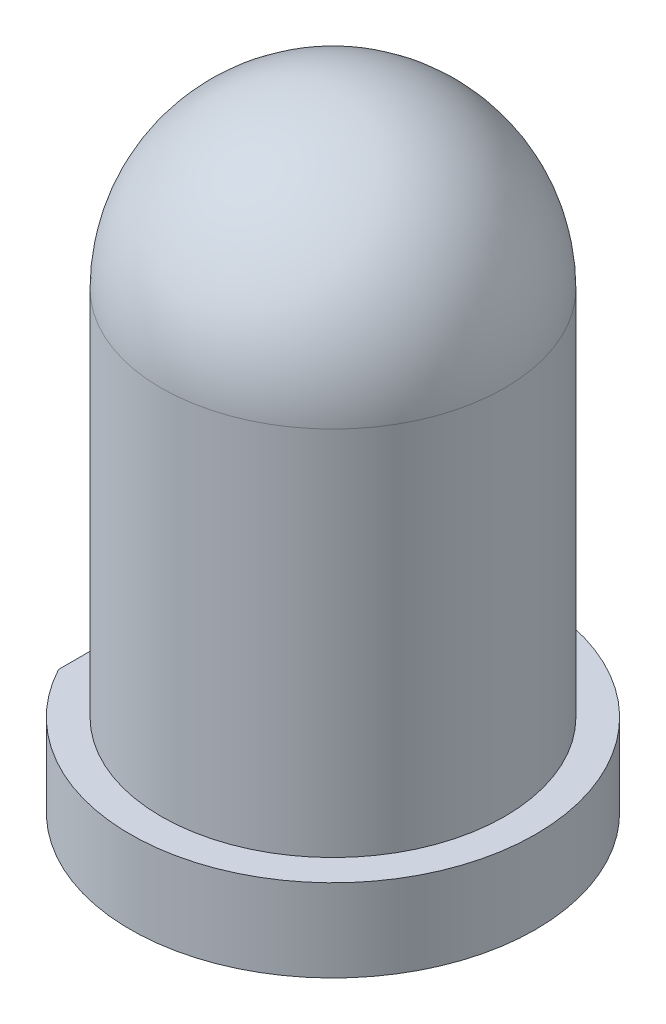
ISO-10303-21;
HEADER;
FILE_DESCRIPTION(('STEP AP214'),'2;1');
FILE_NAME('part.step','',(''),(''),'','','');
FILE_SCHEMA(('AUTOMOTIVE_DESIGN { 1 0 10303 214 1 1 1 1 }'));
ENDSEC;
DATA;
#1=APPLICATION_CONTEXT('core data for automotive mechanical design processes');
#2=APPLICATION_PROTOCOL_DEFINITION('international standard','automotive_design',2000,#1);
#3=PRODUCT_CONTEXT('',#1,'mechanical');
#4=PRODUCT('Part','Part','',(#3));
#5=PRODUCT_RELATED_PRODUCT_CATEGORY('part','',(#4));
#6=PRODUCT_DEFINITION_FORMATION('','',#4);
#7=PRODUCT_DEFINITION_CONTEXT('part definition',#1,'design');
#8=PRODUCT_DEFINITION('design','',#6,#7);
#9=PRODUCT_DEFINITION_SHAPE('','',#8);
#10=(LENGTH_UNIT() NAMED_UNIT(*) SI_UNIT(.MILLI.,.METRE.));
#11=(NAMED_UNIT(*) PLANE_ANGLE_UNIT() SI_UNIT($,.RADIAN.));
#12=(NAMED_UNIT(*) SI_UNIT($,.STERADIAN.) SOLID_ANGLE_UNIT());
#13=UNCERTAINTY_MEASURE_WITH_UNIT(LENGTH_MEASURE(1.E-05),#10,'distance_accuracy_value','');
#14=(GEOMETRIC_REPRESENTATION_CONTEXT(3) GLOBAL_UNCERTAINTY_ASSIGNED_CONTEXT((#13)) GLOBAL_UNIT_ASSIGNED_CONTEXT((#10,
#11,#12)) REPRESENTATION_CONTEXT('',''));
#15=CARTESIAN_POINT('',(0.,0.,0.));
#16=DIRECTION('',(0.,0.,1.));
#17=DIRECTION('',(1.,0.,0.));
#18=AXIS2_PLACEMENT_3D('',#15,#16,#17);
#19=CARTESIAN_POINT('',(0.,0.,0.));
#20=DIRECTION('',(0.,1.,0.));
#21=DIRECTION('',(0.,0.,1.));
#22=AXIS2_PLACEMENT_3D('',#19,#20,#21);
#23=PLANE('',#22);
#24=DIRECTION('',(0.,0.,-1.));
#25=VECTOR('',#24,1.);
#26=CARTESIAN_POINT('',(-2.6,0.,1.393735986477));
#27=LINE('',#26,#25);
#28=CARTESIAN_POINT('',(-2.6,0.,1.39373598647682));
#29=VERTEX_POINT('',#28);
#30=CARTESIAN_POINT('',(-2.59999999999998,0.,-1.39373598647684));
#31=VERTEX_POINT('',#30);
#32=EDGE_CURVE('E50',#29,#31,#27,.T.);
#33=ORIENTED_EDGE('',*,*,#32,.T.);
#34=CARTESIAN_POINT('',(0.,0.,0.));
#35=DIRECTION('',(0.,-1.,0.));
#36=DIRECTION('',(0.,0.,-1.));
#37=AXIS2_PLACEMENT_3D('',#34,#35,#36);
#38=CIRCLE('',#37,2.95);
#39=EDGE_CURVE('E21',#29,#31,#38,.F.);
#40=ORIENTED_EDGE('',*,*,#39,.F.);
#41=EDGE_LOOP('',(#33,#40));
#42=FACE_BOUND('',#41,.T.);
#43=ADVANCED_FACE('F17',(#42),#23,.F.);
#44=CARTESIAN_POINT('',(0.,-5.1,0.));
#45=DIRECTION('',(0.,-1.,0.));
#46=DIRECTION('',(0.,0.,-1.));
#47=AXIS2_PLACEMENT_3D('',#44,#45,#46);
#48=CYLINDRICAL_SURFACE('',#47,2.95);
#49=DIRECTION('',(0.,1.,0.));
#50=VECTOR('',#49,1.);
#51=CARTESIAN_POINT('',(-2.6,0.,1.393735986477));
#52=LINE('',#51,#50);
#53=CARTESIAN_POINT('',(-2.6,1.2,1.39373598647682));
#54=VERTEX_POINT('',#53);
#55=EDGE_CURVE('E48',#54,#29,#52,.F.);
#56=ORIENTED_EDGE('',*,*,#55,.T.);
#57=ORIENTED_EDGE('',*,*,#39,.T.);
#58=DIRECTION('',(0.,1.,0.));
#59=VECTOR('',#58,1.);
#60=CARTESIAN_POINT('',(-2.59999999999998,0.,-1.393735986477));
#61=LINE('',#60,#59);
#62=CARTESIAN_POINT('',(-2.59999999999999,1.2,-1.39373598647682));
#63=VERTEX_POINT('',#62);
#64=EDGE_CURVE('E46',#31,#63,#61,.T.);
#65=ORIENTED_EDGE('',*,*,#64,.T.);
#66=CARTESIAN_POINT('',(0.,1.2,0.));
#67=DIRECTION('',(0.,-1.,0.));
#68=DIRECTION('',(0.,0.,-1.));
#69=AXIS2_PLACEMENT_3D('',#66,#67,#68);
#70=CIRCLE('',#69,2.95);
#71=EDGE_CURVE('E36',#63,#54,#70,.T.);
#72=ORIENTED_EDGE('',*,*,#71,.T.);
#73=EDGE_LOOP('',(#56,#57,#65,#72));
#74=FACE_BOUND('',#73,.T.);
#75=ADVANCED_FACE('F44',(#74),#48,.T.);
#76=CARTESIAN_POINT('',(-2.6,0.,1.393735986477));
#77=DIRECTION('',(1.,0.,0.));
#78=DIRECTION('',(0.,0.,-1.));
#79=AXIS2_PLACEMENT_3D('',#76,#77,#78);
#80=PLANE('',#79);
#81=ORIENTED_EDGE('',*,*,#32,.F.);
#82=ORIENTED_EDGE('',*,*,#55,.F.);
#83=DIRECTION('',(0.,0.,-1.));
#84=VECTOR('',#83,1.);
#85=CARTESIAN_POINT('',(-2.6,1.2,0.));
#86=LINE('',#85,#84);
#87=EDGE_CURVE('E55',#54,#63,#86,.T.);
#88=ORIENTED_EDGE('',*,*,#87,.T.);
#89=ORIENTED_EDGE('',*,*,#64,.F.);
#90=EDGE_LOOP('',(#81,#82,#88,#89));
#91=FACE_BOUND('',#90,.T.);
#92=ADVANCED_FACE('F53',(#91),#80,.F.);
#93=CARTESIAN_POINT('',(2.95,1.2,0.));
#94=DIRECTION('',(0.,-1.,0.));
#95=DIRECTION('',(0.,0.,-1.));
#96=AXIS2_PLACEMENT_3D('',#93,#94,#95);
#97=PLANE('',#96);
#98=ORIENTED_EDGE('',*,*,#71,.F.);
#99=ORIENTED_EDGE('',*,*,#87,.F.);
#100=EDGE_LOOP('',(#98,#99));
#101=FACE_BOUND('',#100,.T.);
#102=CARTESIAN_POINT('',(0.,1.2,0.));
#103=DIRECTION('',(0.,-1.,0.));
#104=DIRECTION('',(0.,0.,-1.));
#105=AXIS2_PLACEMENT_3D('',#102,#103,#104);
#106=CIRCLE('',#105,2.5);
#107=CARTESIAN_POINT('',(0.,1.2,-2.5));
#108=VERTEX_POINT('',#107);
#109=EDGE_CURVE('E11',#108,#108,#106,.F.);
#110=ORIENTED_EDGE('',*,*,#109,.F.);
#111=EDGE_LOOP('',(#110));
#112=FACE_BOUND('',#111,.T.);
#113=ADVANCED_FACE('F66',(#101,#112),#97,.F.);
#114=CARTESIAN_POINT('',(0.,6.6,0.));
#115=DIRECTION('',(1.,0.,0.));
#116=DIRECTION('',(0.,0.,1.));
#117=AXIS2_PLACEMENT_3D('',#114,#115,#116);
#118=SPHERICAL_SURFACE('',#117,2.5);
#119=CARTESIAN_POINT('',(0.,6.6,0.));
#120=DIRECTION('',(0.,-1.,0.));
#121=DIRECTION('',(0.,0.,-1.));
#122=AXIS2_PLACEMENT_3D('',#119,#120,#121);
#123=SPHERICAL_SURFACE('',#122,2.5);
#124=CARTESIAN_POINT('',(0.,6.6,0.));
#125=DIRECTION('',(0.,-1.,0.));
#126=DIRECTION('',(0.,0.,-1.));
#127=AXIS2_PLACEMENT_3D('',#124,#125,#126);
#128=CIRCLE('',#127,2.5);
#129=CARTESIAN_POINT('',(0.,6.6,-2.5));
#130=VERTEX_POINT('',#129);
#131=EDGE_CURVE('E27',#130,#130,#128,.T.);
#132=ORIENTED_EDGE('',*,*,#131,.F.);
#133=EDGE_LOOP('',(#132));
#134=FACE_BOUND('',#133,.T.);
#135=ADVANCED_FACE('F19',(#134),#123,.T.);
#136=CARTESIAN_POINT('',(0.,-5.1,0.));
#137=DIRECTION('',(0.,-1.,0.));
#138=DIRECTION('',(0.,0.,-1.));
#139=AXIS2_PLACEMENT_3D('',#136,#137,#138);
#140=CYLINDRICAL_SURFACE('',#139,2.5);
#141=ORIENTED_EDGE('',*,*,#109,.T.);
#142=EDGE_LOOP('',(#141));
#143=FACE_BOUND('',#142,.T.);
#144=ORIENTED_EDGE('',*,*,#131,.T.);
#145=EDGE_LOOP('',(#144));
#146=FACE_BOUND('',#145,.T.);
#147=ADVANCED_FACE('F63',(#143,#146),#140,.T.);
#148=CLOSED_SHELL('',(#43,#75,#92,#113,#135,#147));
#149=MANIFOLD_SOLID_BREP('B1',#148);
#150=ADVANCED_BREP_SHAPE_REPRESENTATION('',(#18,#149),#14);
#151=SHAPE_DEFINITION_REPRESENTATION(#9,#150);
ENDSEC;
END-ISO-10303-21;
